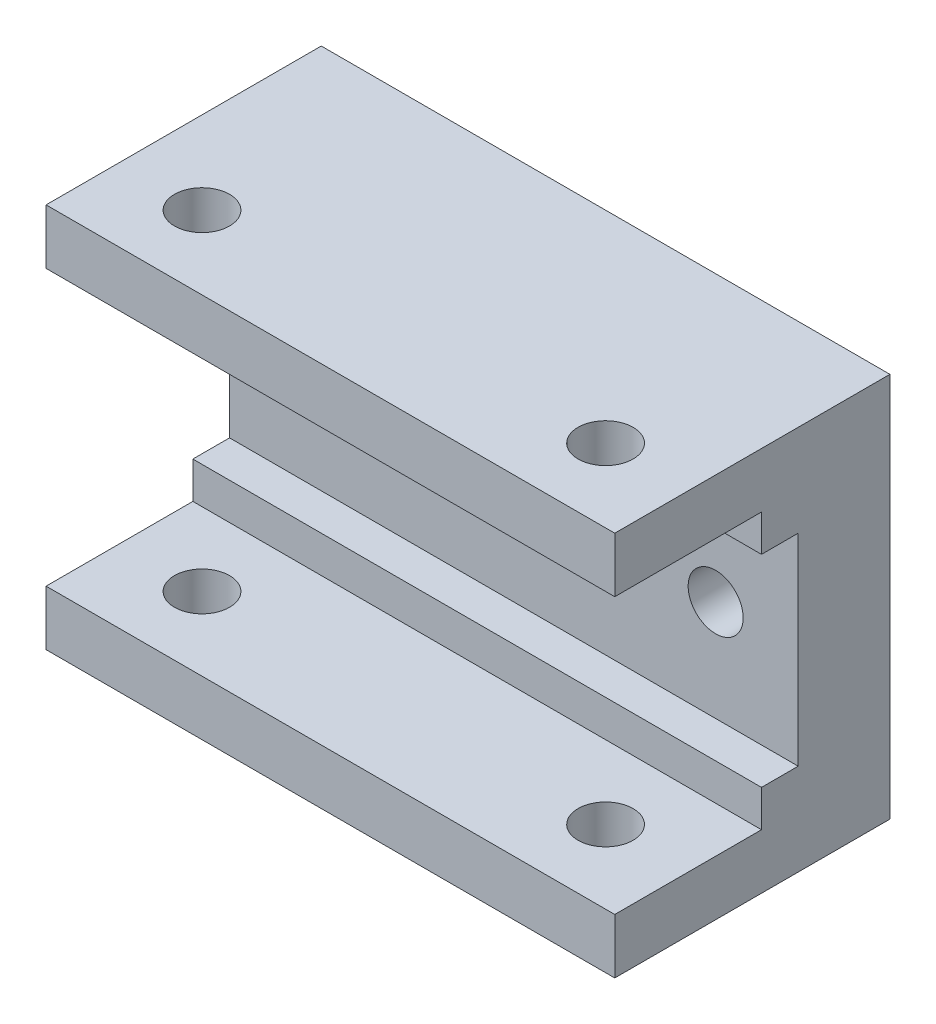
ISO-10303-21;
HEADER;
FILE_DESCRIPTION(('STEP AP214'),'2;1');
FILE_NAME('part.step','',(''),(''),'','','');
FILE_SCHEMA(('AUTOMOTIVE_DESIGN { 1 0 10303 214 1 1 1 1 }'));
ENDSEC;
DATA;
#1=APPLICATION_CONTEXT('core data for automotive mechanical design processes');
#2=APPLICATION_PROTOCOL_DEFINITION('international standard','automotive_design',2000,#1);
#3=PRODUCT_CONTEXT('',#1,'mechanical');
#4=PRODUCT('Part','Part','',(#3));
#5=PRODUCT_RELATED_PRODUCT_CATEGORY('part','',(#4));
#6=PRODUCT_DEFINITION_FORMATION('','',#4);
#7=PRODUCT_DEFINITION_CONTEXT('part definition',#1,'design');
#8=PRODUCT_DEFINITION('design','',#6,#7);
#9=PRODUCT_DEFINITION_SHAPE('','',#8);
#10=(LENGTH_UNIT() NAMED_UNIT(*) SI_UNIT(.MILLI.,.METRE.));
#11=(NAMED_UNIT(*) PLANE_ANGLE_UNIT() SI_UNIT($,.RADIAN.));
#12=(NAMED_UNIT(*) SI_UNIT($,.STERADIAN.) SOLID_ANGLE_UNIT());
#13=UNCERTAINTY_MEASURE_WITH_UNIT(LENGTH_MEASURE(1.E-05),#10,'distance_accuracy_value','');
#14=(GEOMETRIC_REPRESENTATION_CONTEXT(3) GLOBAL_UNCERTAINTY_ASSIGNED_CONTEXT((#13)) GLOBAL_UNIT_ASSIGNED_CONTEXT((#10,
#11,#12)) REPRESENTATION_CONTEXT('',''));
#15=CARTESIAN_POINT('',(0.,0.,0.));
#16=DIRECTION('',(0.,0.,1.));
#17=DIRECTION('',(1.,0.,0.));
#18=AXIS2_PLACEMENT_3D('',#15,#16,#17);
#19=CARTESIAN_POINT('',(0.,0.,5.));
#20=DIRECTION('',(0.,0.,1.));
#21=DIRECTION('',(1.,0.,0.));
#22=AXIS2_PLACEMENT_3D('',#19,#20,#21);
#23=PLANE('',#22);
#24=CARTESIAN_POINT('',(11.,0.,5.));
#25=DIRECTION('',(0.,0.,1.));
#26=DIRECTION('',(1.,0.,0.));
#27=AXIS2_PLACEMENT_3D('',#24,#25,#26);
#28=CIRCLE('',#27,1.5);
#29=CARTESIAN_POINT('',(12.5,0.,5.));
#30=VERTEX_POINT('',#29);
#31=EDGE_CURVE('E207',#30,#30,#28,.T.);
#32=ORIENTED_EDGE('',*,*,#31,.F.);
#33=EDGE_LOOP('',(#32));
#34=FACE_BOUND('',#33,.T.);
#35=CARTESIAN_POINT('',(-11.,0.,5.));
#36=DIRECTION('',(0.,0.,1.));
#37=DIRECTION('',(1.,0.,0.));
#38=AXIS2_PLACEMENT_3D('',#35,#36,#37);
#39=CIRCLE('',#38,1.5);
#40=CARTESIAN_POINT('',(-9.5,0.,5.));
#41=VERTEX_POINT('',#40);
#42=EDGE_CURVE('E200',#41,#41,#39,.T.);
#43=ORIENTED_EDGE('',*,*,#42,.F.);
#44=EDGE_LOOP('',(#43));
#45=FACE_BOUND('',#44,.T.);
#46=DIRECTION('',(0.,-1.,0.));
#47=VECTOR('',#46,1.);
#48=CARTESIAN_POINT('',(-15.5,10.5,5.));
#49=LINE('',#48,#47);
#50=CARTESIAN_POINT('',(-15.5,5.5,5.));
#51=VERTEX_POINT('',#50);
#52=CARTESIAN_POINT('',(-15.5,-5.49999999999999,5.));
#53=VERTEX_POINT('',#52);
#54=EDGE_CURVE('E62',#51,#53,#49,.T.);
#55=ORIENTED_EDGE('',*,*,#54,.T.);
#56=DIRECTION('',(-1.,0.,0.));
#57=VECTOR('',#56,1.);
#58=CARTESIAN_POINT('',(-15.5,-5.5,5.));
#59=LINE('',#58,#57);
#60=CARTESIAN_POINT('',(15.5,-5.49999999999999,5.));
#61=VERTEX_POINT('',#60);
#62=EDGE_CURVE('E57',#61,#53,#59,.T.);
#63=ORIENTED_EDGE('',*,*,#62,.F.);
#64=DIRECTION('',(0.,1.,0.));
#65=VECTOR('',#64,1.);
#66=CARTESIAN_POINT('',(15.5,10.5,5.));
#67=LINE('',#66,#65);
#68=CARTESIAN_POINT('',(15.5,5.5,5.));
#69=VERTEX_POINT('',#68);
#70=EDGE_CURVE('E274',#61,#69,#67,.T.);
#71=ORIENTED_EDGE('',*,*,#70,.T.);
#72=DIRECTION('',(1.,0.,0.));
#73=VECTOR('',#72,1.);
#74=CARTESIAN_POINT('',(-15.5,5.5,5.));
#75=LINE('',#74,#73);
#76=EDGE_CURVE('E171',#51,#69,#75,.T.);
#77=ORIENTED_EDGE('',*,*,#76,.F.);
#78=EDGE_LOOP('',(#55,#63,#71,#77));
#79=FACE_BOUND('',#78,.T.);
#80=ADVANCED_FACE('F39',(#34,#45,#79),#23,.T.);
#81=CARTESIAN_POINT('',(-15.5,-7.5,15.));
#82=DIRECTION('',(0.,-1.,0.));
#83=DIRECTION('',(0.,0.,-1.));
#84=AXIS2_PLACEMENT_3D('',#81,#82,#83);
#85=PLANE('',#84);
#86=CARTESIAN_POINT('',(-11.,-7.5,11.));
#87=DIRECTION('',(0.,-1.,0.));
#88=DIRECTION('',(0.,0.,-1.));
#89=AXIS2_PLACEMENT_3D('',#86,#87,#88);
#90=CIRCLE('',#89,1.5);
#91=CARTESIAN_POINT('',(-11.,-7.5,12.5));
#92=VERTEX_POINT('',#91);
#93=EDGE_CURVE('E216',#92,#92,#90,.T.);
#94=ORIENTED_EDGE('',*,*,#93,.T.);
#95=EDGE_LOOP('',(#94));
#96=FACE_BOUND('',#95,.T.);
#97=CARTESIAN_POINT('',(11.,-7.5,11.));
#98=DIRECTION('',(0.,-1.,0.));
#99=DIRECTION('',(0.,0.,-1.));
#100=AXIS2_PLACEMENT_3D('',#97,#98,#99);
#101=CIRCLE('',#100,1.5);
#102=CARTESIAN_POINT('',(11.,-7.5,12.5));
#103=VERTEX_POINT('',#102);
#104=EDGE_CURVE('E43',#103,#103,#101,.T.);
#105=ORIENTED_EDGE('',*,*,#104,.T.);
#106=EDGE_LOOP('',(#105));
#107=FACE_BOUND('',#106,.T.);
#108=DIRECTION('',(1.,0.,0.));
#109=VECTOR('',#108,1.);
#110=CARTESIAN_POINT('',(-15.5,-7.5,7.));
#111=LINE('',#110,#109);
#112=CARTESIAN_POINT('',(-15.5,-7.5,7.));
#113=VERTEX_POINT('',#112);
#114=CARTESIAN_POINT('',(15.5,-7.5,7.));
#115=VERTEX_POINT('',#114);
#116=EDGE_CURVE('E134',#113,#115,#111,.T.);
#117=ORIENTED_EDGE('',*,*,#116,.F.);
#118=DIRECTION('',(0.,0.,-1.));
#119=VECTOR('',#118,1.);
#120=CARTESIAN_POINT('',(-15.5,-7.5,15.));
#121=LINE('',#120,#119);
#122=CARTESIAN_POINT('',(-15.5,-7.5,15.));
#123=VERTEX_POINT('',#122);
#124=EDGE_CURVE('E142',#123,#113,#121,.T.);
#125=ORIENTED_EDGE('',*,*,#124,.F.);
#126=DIRECTION('',(-1.,0.,0.));
#127=VECTOR('',#126,1.);
#128=CARTESIAN_POINT('',(-15.5,-7.5,15.));
#129=LINE('',#128,#127);
#130=CARTESIAN_POINT('',(15.5,-7.5,15.));
#131=VERTEX_POINT('',#130);
#132=EDGE_CURVE('E136',#131,#123,#129,.T.);
#133=ORIENTED_EDGE('',*,*,#132,.F.);
#134=DIRECTION('',(0.,0.,-1.));
#135=VECTOR('',#134,1.);
#136=CARTESIAN_POINT('',(15.5,-7.5,15.));
#137=LINE('',#136,#135);
#138=EDGE_CURVE('E130',#131,#115,#137,.T.);
#139=ORIENTED_EDGE('',*,*,#138,.T.);
#140=EDGE_LOOP('',(#117,#125,#133,#139));
#141=FACE_BOUND('',#140,.T.);
#142=ADVANCED_FACE('F132',(#96,#107,#141),#85,.F.);
#143=CARTESIAN_POINT('',(15.5,10.5,5.));
#144=DIRECTION('',(-1.,0.,0.));
#145=DIRECTION('',(0.,-1.,0.));
#146=AXIS2_PLACEMENT_3D('',#143,#144,#145);
#147=PLANE('',#146);
#148=ORIENTED_EDGE('',*,*,#70,.F.);
#149=DIRECTION('',(0.,0.,-1.));
#150=VECTOR('',#149,1.);
#151=CARTESIAN_POINT('',(15.5,-5.5,7.));
#152=LINE('',#151,#150);
#153=CARTESIAN_POINT('',(15.5,-5.5,7.));
#154=VERTEX_POINT('',#153);
#155=EDGE_CURVE('E154',#154,#61,#152,.T.);
#156=ORIENTED_EDGE('',*,*,#155,.F.);
#157=DIRECTION('',(0.,1.,0.));
#158=VECTOR('',#157,1.);
#159=CARTESIAN_POINT('',(15.5,-7.5,7.));
#160=LINE('',#159,#158);
#161=EDGE_CURVE('E147',#115,#154,#160,.T.);
#162=ORIENTED_EDGE('',*,*,#161,.F.);
#163=ORIENTED_EDGE('',*,*,#138,.F.);
#164=DIRECTION('',(0.,1.,0.));
#165=VECTOR('',#164,1.);
#166=CARTESIAN_POINT('',(15.5,-10.5,15.));
#167=LINE('',#166,#165);
#168=CARTESIAN_POINT('',(15.5,-10.5,15.));
#169=VERTEX_POINT('',#168);
#170=EDGE_CURVE('E244',#169,#131,#167,.T.);
#171=ORIENTED_EDGE('',*,*,#170,.F.);
#172=DIRECTION('',(0.,0.,-1.));
#173=VECTOR('',#172,1.);
#174=CARTESIAN_POINT('',(15.5,-10.5,5.));
#175=LINE('',#174,#173);
#176=CARTESIAN_POINT('',(15.5,-10.5,0.));
#177=VERTEX_POINT('',#176);
#178=EDGE_CURVE('E280',#169,#177,#175,.T.);
#179=ORIENTED_EDGE('',*,*,#178,.T.);
#180=DIRECTION('',(0.,1.,0.));
#181=VECTOR('',#180,1.);
#182=CARTESIAN_POINT('',(15.5,10.5,0.));
#183=LINE('',#182,#181);
#184=CARTESIAN_POINT('',(15.5,10.5,0.));
#185=VERTEX_POINT('',#184);
#186=EDGE_CURVE('E273',#177,#185,#183,.T.);
#187=ORIENTED_EDGE('',*,*,#186,.T.);
#188=DIRECTION('',(0.,0.,-1.));
#189=VECTOR('',#188,1.);
#190=CARTESIAN_POINT('',(15.5,10.5,5.));
#191=LINE('',#190,#189);
#192=CARTESIAN_POINT('',(15.5,10.5,15.));
#193=VERTEX_POINT('',#192);
#194=EDGE_CURVE('E11',#193,#185,#191,.T.);
#195=ORIENTED_EDGE('',*,*,#194,.F.);
#196=DIRECTION('',(0.,1.,0.));
#197=VECTOR('',#196,1.);
#198=CARTESIAN_POINT('',(15.5,10.5,15.));
#199=LINE('',#198,#197);
#200=CARTESIAN_POINT('',(15.5,7.5,15.));
#201=VERTEX_POINT('',#200);
#202=EDGE_CURVE('E257',#201,#193,#199,.T.);
#203=ORIENTED_EDGE('',*,*,#202,.F.);
#204=DIRECTION('',(0.,0.,-1.));
#205=VECTOR('',#204,1.);
#206=CARTESIAN_POINT('',(15.5,7.5,15.));
#207=LINE('',#206,#205);
#208=CARTESIAN_POINT('',(15.5,7.5,7.));
#209=VERTEX_POINT('',#208);
#210=EDGE_CURVE('E265',#201,#209,#207,.T.);
#211=ORIENTED_EDGE('',*,*,#210,.T.);
#212=DIRECTION('',(0.,1.,0.));
#213=VECTOR('',#212,1.);
#214=CARTESIAN_POINT('',(15.5,7.5,7.));
#215=LINE('',#214,#213);
#216=CARTESIAN_POINT('',(15.5,5.5,7.));
#217=VERTEX_POINT('',#216);
#218=EDGE_CURVE('E179',#217,#209,#215,.T.);
#219=ORIENTED_EDGE('',*,*,#218,.F.);
#220=DIRECTION('',(0.,0.,-1.));
#221=VECTOR('',#220,1.);
#222=CARTESIAN_POINT('',(15.5,5.5,7.));
#223=LINE('',#222,#221);
#224=EDGE_CURVE('E185',#217,#69,#223,.T.);
#225=ORIENTED_EDGE('',*,*,#224,.T.);
#226=EDGE_LOOP('',(#148,#156,#162,#163,#171,#179,#187,#195,#203,#211,#219,#225));
#227=FACE_BOUND('',#226,.T.);
#228=ADVANCED_FACE('F41',(#227),#147,.F.);
#229=CARTESIAN_POINT('',(-15.5,10.5,5.));
#230=DIRECTION('',(0.,-1.,0.));
#231=DIRECTION('',(0.,0.,-1.));
#232=AXIS2_PLACEMENT_3D('',#229,#230,#231);
#233=PLANE('',#232);
#234=CARTESIAN_POINT('',(11.,10.5,11.));
#235=DIRECTION('',(0.,1.,0.));
#236=DIRECTION('',(0.,0.,1.));
#237=AXIS2_PLACEMENT_3D('',#234,#235,#236);
#238=CIRCLE('',#237,1.5);
#239=CARTESIAN_POINT('',(11.,10.5,12.5));
#240=VERTEX_POINT('',#239);
#241=EDGE_CURVE('E217',#240,#240,#238,.T.);
#242=ORIENTED_EDGE('',*,*,#241,.F.);
#243=EDGE_LOOP('',(#242));
#244=FACE_BOUND('',#243,.T.);
#245=CARTESIAN_POINT('',(-11.,10.5,11.));
#246=DIRECTION('',(0.,1.,0.));
#247=DIRECTION('',(0.,0.,-1.));
#248=AXIS2_PLACEMENT_3D('',#245,#246,#247);
#249=CIRCLE('',#248,1.5);
#250=CARTESIAN_POINT('',(-11.,10.5,12.5));
#251=VERTEX_POINT('',#250);
#252=EDGE_CURVE('E211',#251,#251,#249,.T.);
#253=ORIENTED_EDGE('',*,*,#252,.F.);
#254=EDGE_LOOP('',(#253));
#255=FACE_BOUND('',#254,.T.);
#256=DIRECTION('',(-1.,0.,0.));
#257=VECTOR('',#256,1.);
#258=CARTESIAN_POINT('',(-15.5,10.5,0.));
#259=LINE('',#258,#257);
#260=CARTESIAN_POINT('',(-15.5,10.5,0.));
#261=VERTEX_POINT('',#260);
#262=EDGE_CURVE('E284',#185,#261,#259,.T.);
#263=ORIENTED_EDGE('',*,*,#262,.T.);
#264=DIRECTION('',(0.,0.,-1.));
#265=VECTOR('',#264,1.);
#266=CARTESIAN_POINT('',(-15.5,10.5,5.));
#267=LINE('',#266,#265);
#268=CARTESIAN_POINT('',(-15.5,10.5,15.));
#269=VERTEX_POINT('',#268);
#270=EDGE_CURVE('E49',#269,#261,#267,.T.);
#271=ORIENTED_EDGE('',*,*,#270,.F.);
#272=DIRECTION('',(-1.,0.,0.));
#273=VECTOR('',#272,1.);
#274=CARTESIAN_POINT('',(-15.5,10.5,15.));
#275=LINE('',#274,#273);
#276=EDGE_CURVE('E261',#193,#269,#275,.T.);
#277=ORIENTED_EDGE('',*,*,#276,.F.);
#278=ORIENTED_EDGE('',*,*,#194,.T.);
#279=EDGE_LOOP('',(#263,#271,#277,#278));
#280=FACE_BOUND('',#279,.T.);
#281=ADVANCED_FACE('F350',(#244,#255,#280),#233,.F.);
#282=CARTESIAN_POINT('',(-15.5,10.5,5.));
#283=DIRECTION('',(1.,0.,0.));
#284=DIRECTION('',(0.,0.,-1.));
#285=AXIS2_PLACEMENT_3D('',#282,#283,#284);
#286=PLANE('',#285);
#287=ORIENTED_EDGE('',*,*,#54,.F.);
#288=DIRECTION('',(0.,0.,-1.));
#289=VECTOR('',#288,1.);
#290=CARTESIAN_POINT('',(-15.5,5.5,7.));
#291=LINE('',#290,#289);
#292=CARTESIAN_POINT('',(-15.5,5.5,7.));
#293=VERTEX_POINT('',#292);
#294=EDGE_CURVE('E192',#293,#51,#291,.T.);
#295=ORIENTED_EDGE('',*,*,#294,.F.);
#296=DIRECTION('',(0.,-1.,0.));
#297=VECTOR('',#296,1.);
#298=CARTESIAN_POINT('',(-15.5,7.5,7.));
#299=LINE('',#298,#297);
#300=CARTESIAN_POINT('',(-15.5,7.5,7.));
#301=VERTEX_POINT('',#300);
#302=EDGE_CURVE('E172',#301,#293,#299,.T.);
#303=ORIENTED_EDGE('',*,*,#302,.F.);
#304=DIRECTION('',(0.,0.,-1.));
#305=VECTOR('',#304,1.);
#306=CARTESIAN_POINT('',(-15.5,7.5,15.));
#307=LINE('',#306,#305);
#308=CARTESIAN_POINT('',(-15.5,7.5,15.));
#309=VERTEX_POINT('',#308);
#310=EDGE_CURVE('E269',#309,#301,#307,.T.);
#311=ORIENTED_EDGE('',*,*,#310,.F.);
#312=DIRECTION('',(0.,-1.,0.));
#313=VECTOR('',#312,1.);
#314=CARTESIAN_POINT('',(-15.5,10.5,15.));
#315=LINE('',#314,#313);
#316=EDGE_CURVE('E141',#269,#309,#315,.T.);
#317=ORIENTED_EDGE('',*,*,#316,.F.);
#318=ORIENTED_EDGE('',*,*,#270,.T.);
#319=DIRECTION('',(0.,-1.,0.));
#320=VECTOR('',#319,1.);
#321=CARTESIAN_POINT('',(-15.5,10.5,0.));
#322=LINE('',#321,#320);
#323=CARTESIAN_POINT('',(-15.5,-10.5,0.));
#324=VERTEX_POINT('',#323);
#325=EDGE_CURVE('E287',#261,#324,#322,.T.);
#326=ORIENTED_EDGE('',*,*,#325,.T.);
#327=DIRECTION('',(0.,0.,-1.));
#328=VECTOR('',#327,1.);
#329=CARTESIAN_POINT('',(-15.5,-10.5,5.));
#330=LINE('',#329,#328);
#331=CARTESIAN_POINT('',(-15.5,-10.5,15.));
#332=VERTEX_POINT('',#331);
#333=EDGE_CURVE('E295',#332,#324,#330,.T.);
#334=ORIENTED_EDGE('',*,*,#333,.F.);
#335=DIRECTION('',(0.,-1.,0.));
#336=VECTOR('',#335,1.);
#337=CARTESIAN_POINT('',(-15.5,-10.5,15.));
#338=LINE('',#337,#336);
#339=EDGE_CURVE('E236',#123,#332,#338,.T.);
#340=ORIENTED_EDGE('',*,*,#339,.F.);
#341=ORIENTED_EDGE('',*,*,#124,.T.);
#342=DIRECTION('',(0.,-1.,0.));
#343=VECTOR('',#342,1.);
#344=CARTESIAN_POINT('',(-15.5,-7.5,7.));
#345=LINE('',#344,#343);
#346=CARTESIAN_POINT('',(-15.5,-5.5,7.));
#347=VERTEX_POINT('',#346);
#348=EDGE_CURVE('E150',#347,#113,#345,.T.);
#349=ORIENTED_EDGE('',*,*,#348,.F.);
#350=DIRECTION('',(0.,0.,-1.));
#351=VECTOR('',#350,1.);
#352=CARTESIAN_POINT('',(-15.5,-5.5,7.));
#353=LINE('',#352,#351);
#354=EDGE_CURVE('E160',#347,#53,#353,.T.);
#355=ORIENTED_EDGE('',*,*,#354,.T.);
#356=EDGE_LOOP('',(#287,#295,#303,#311,#317,#318,#326,#334,#340,#341,#349,#355));
#357=FACE_BOUND('',#356,.T.);
#358=ADVANCED_FACE('F347',(#357),#286,.F.);
#359=CARTESIAN_POINT('',(-15.5,-10.5,5.));
#360=DIRECTION('',(0.,1.,0.));
#361=DIRECTION('',(0.,0.,1.));
#362=AXIS2_PLACEMENT_3D('',#359,#360,#361);
#363=PLANE('',#362);
#364=CARTESIAN_POINT('',(11.,-10.5,11.));
#365=DIRECTION('',(0.,1.,0.));
#366=DIRECTION('',(0.,0.,1.));
#367=AXIS2_PLACEMENT_3D('',#364,#365,#366);
#368=CIRCLE('',#367,1.5);
#369=CARTESIAN_POINT('',(11.,-10.5,12.5));
#370=VERTEX_POINT('',#369);
#371=EDGE_CURVE('E212',#370,#370,#368,.T.);
#372=ORIENTED_EDGE('',*,*,#371,.T.);
#373=EDGE_LOOP('',(#372));
#374=FACE_BOUND('',#373,.T.);
#375=CARTESIAN_POINT('',(-11.,-10.5,11.));
#376=DIRECTION('',(0.,1.,0.));
#377=DIRECTION('',(0.,0.,-1.));
#378=AXIS2_PLACEMENT_3D('',#375,#376,#377);
#379=CIRCLE('',#378,1.5);
#380=CARTESIAN_POINT('',(-11.,-10.5,12.5));
#381=VERTEX_POINT('',#380);
#382=EDGE_CURVE('E221',#381,#381,#379,.T.);
#383=ORIENTED_EDGE('',*,*,#382,.T.);
#384=EDGE_LOOP('',(#383));
#385=FACE_BOUND('',#384,.T.);
#386=DIRECTION('',(1.,0.,0.));
#387=VECTOR('',#386,1.);
#388=CARTESIAN_POINT('',(-15.5,-10.5,0.));
#389=LINE('',#388,#387);
#390=EDGE_CURVE('E277',#324,#177,#389,.T.);
#391=ORIENTED_EDGE('',*,*,#390,.T.);
#392=ORIENTED_EDGE('',*,*,#178,.F.);
#393=DIRECTION('',(1.,0.,0.));
#394=VECTOR('',#393,1.);
#395=CARTESIAN_POINT('',(-15.5,-10.5,15.));
#396=LINE('',#395,#394);
#397=EDGE_CURVE('E240',#332,#169,#396,.T.);
#398=ORIENTED_EDGE('',*,*,#397,.F.);
#399=ORIENTED_EDGE('',*,*,#333,.T.);
#400=EDGE_LOOP('',(#391,#392,#398,#399));
#401=FACE_BOUND('',#400,.T.);
#402=ADVANCED_FACE('F343',(#374,#385,#401),#363,.F.);
#403=CARTESIAN_POINT('',(0.,0.,0.));
#404=DIRECTION('',(0.,0.,1.));
#405=DIRECTION('',(1.,0.,0.));
#406=AXIS2_PLACEMENT_3D('',#403,#404,#405);
#407=PLANE('',#406);
#408=CARTESIAN_POINT('',(11.,0.,0.));
#409=DIRECTION('',(0.,0.,-1.));
#410=DIRECTION('',(-1.,0.,0.));
#411=AXIS2_PLACEMENT_3D('',#408,#409,#410);
#412=CIRCLE('',#411,1.5);
#413=CARTESIAN_POINT('',(9.5,0.,0.));
#414=VERTEX_POINT('',#413);
#415=EDGE_CURVE('E196',#414,#414,#412,.T.);
#416=ORIENTED_EDGE('',*,*,#415,.F.);
#417=EDGE_LOOP('',(#416));
#418=FACE_BOUND('',#417,.T.);
#419=CARTESIAN_POINT('',(-11.,0.,0.));
#420=DIRECTION('',(0.,0.,-1.));
#421=DIRECTION('',(1.,0.,0.));
#422=AXIS2_PLACEMENT_3D('',#419,#420,#421);
#423=CIRCLE('',#422,1.5);
#424=CARTESIAN_POINT('',(-9.5,0.,0.));
#425=VERTEX_POINT('',#424);
#426=EDGE_CURVE('E195',#425,#425,#423,.T.);
#427=ORIENTED_EDGE('',*,*,#426,.F.);
#428=EDGE_LOOP('',(#427));
#429=FACE_BOUND('',#428,.T.);
#430=ORIENTED_EDGE('',*,*,#186,.F.);
#431=ORIENTED_EDGE('',*,*,#390,.F.);
#432=ORIENTED_EDGE('',*,*,#325,.F.);
#433=ORIENTED_EDGE('',*,*,#262,.F.);
#434=EDGE_LOOP('',(#430,#431,#432,#433));
#435=FACE_BOUND('',#434,.T.);
#436=ADVANCED_FACE('F340',(#418,#429,#435),#407,.F.);
#437=CARTESIAN_POINT('',(-15.5,7.5,15.));
#438=DIRECTION('',(0.,1.,0.));
#439=DIRECTION('',(-1.,0.,0.));
#440=AXIS2_PLACEMENT_3D('',#437,#438,#439);
#441=PLANE('',#440);
#442=CARTESIAN_POINT('',(11.,7.5,11.));
#443=DIRECTION('',(0.,1.,0.));
#444=DIRECTION('',(-1.,0.,0.));
#445=AXIS2_PLACEMENT_3D('',#442,#443,#444);
#446=CIRCLE('',#445,1.5);
#447=CARTESIAN_POINT('',(11.,7.5,12.5));
#448=VERTEX_POINT('',#447);
#449=EDGE_CURVE('E232',#448,#448,#446,.T.);
#450=ORIENTED_EDGE('',*,*,#449,.T.);
#451=EDGE_LOOP('',(#450));
#452=FACE_BOUND('',#451,.T.);
#453=CARTESIAN_POINT('',(-11.,7.5,11.));
#454=DIRECTION('',(0.,1.,0.));
#455=DIRECTION('',(-1.,0.,0.));
#456=AXIS2_PLACEMENT_3D('',#453,#454,#455);
#457=CIRCLE('',#456,1.5);
#458=CARTESIAN_POINT('',(-11.,7.5,12.5));
#459=VERTEX_POINT('',#458);
#460=EDGE_CURVE('E228',#459,#459,#457,.T.);
#461=ORIENTED_EDGE('',*,*,#460,.T.);
#462=EDGE_LOOP('',(#461));
#463=FACE_BOUND('',#462,.T.);
#464=ORIENTED_EDGE('',*,*,#310,.T.);
#465=DIRECTION('',(-1.,0.,0.));
#466=VECTOR('',#465,1.);
#467=CARTESIAN_POINT('',(-15.5,7.5,7.));
#468=LINE('',#467,#466);
#469=EDGE_CURVE('E182',#209,#301,#468,.T.);
#470=ORIENTED_EDGE('',*,*,#469,.F.);
#471=ORIENTED_EDGE('',*,*,#210,.F.);
#472=DIRECTION('',(1.,0.,0.));
#473=VECTOR('',#472,1.);
#474=CARTESIAN_POINT('',(-15.5,7.5,15.));
#475=LINE('',#474,#473);
#476=EDGE_CURVE('E254',#309,#201,#475,.T.);
#477=ORIENTED_EDGE('',*,*,#476,.F.);
#478=EDGE_LOOP('',(#464,#470,#471,#477));
#479=FACE_BOUND('',#478,.T.);
#480=ADVANCED_FACE('F338',(#452,#463,#479),#441,.F.);
#481=CARTESIAN_POINT('',(0.,0.,15.));
#482=DIRECTION('',(0.,0.,1.));
#483=DIRECTION('',(1.,0.,0.));
#484=AXIS2_PLACEMENT_3D('',#481,#482,#483);
#485=PLANE('',#484);
#486=ORIENTED_EDGE('',*,*,#316,.T.);
#487=ORIENTED_EDGE('',*,*,#476,.T.);
#488=ORIENTED_EDGE('',*,*,#202,.T.);
#489=ORIENTED_EDGE('',*,*,#276,.T.);
#490=EDGE_LOOP('',(#486,#487,#488,#489));
#491=FACE_BOUND('',#490,.T.);
#492=ADVANCED_FACE('F321',(#491),#485,.T.);
#493=CARTESIAN_POINT('',(0.,0.,15.));
#494=DIRECTION('',(0.,0.,-1.));
#495=DIRECTION('',(-1.,0.,0.));
#496=AXIS2_PLACEMENT_3D('',#493,#494,#495);
#497=PLANE('',#496);
#498=ORIENTED_EDGE('',*,*,#339,.T.);
#499=ORIENTED_EDGE('',*,*,#397,.T.);
#500=ORIENTED_EDGE('',*,*,#170,.T.);
#501=ORIENTED_EDGE('',*,*,#132,.T.);
#502=EDGE_LOOP('',(#498,#499,#500,#501));
#503=FACE_BOUND('',#502,.T.);
#504=ADVANCED_FACE('F310',(#503),#497,.F.);
#505=CARTESIAN_POINT('',(-11.,-10.5,11.));
#506=DIRECTION('',(0.,1.,0.));
#507=DIRECTION('',(0.,0.,1.));
#508=AXIS2_PLACEMENT_3D('',#505,#506,#507);
#509=CYLINDRICAL_SURFACE('',#508,1.5);
#510=CARTESIAN_POINT('',(-11.,-10.5,12.5));
#511=CARTESIAN_POINT('',(-11.,-10.46875,12.5));
#512=CARTESIAN_POINT('',(-11.,-10.4375,12.5));
#513=CARTESIAN_POINT('',(-11.,-10.375,12.5));
#514=CARTESIAN_POINT('',(-11.,-10.34375,12.5));
#515=CARTESIAN_POINT('',(-11.,-10.28125,12.5));
#516=CARTESIAN_POINT('',(-11.,-10.25,12.5));
#517=CARTESIAN_POINT('',(-11.,-10.1875,12.5));
#518=CARTESIAN_POINT('',(-11.,-10.15625,12.5));
#519=CARTESIAN_POINT('',(-11.,-10.09375,12.5));
#520=CARTESIAN_POINT('',(-11.,-10.0625,12.5));
#521=CARTESIAN_POINT('',(-11.,-10.,12.5));
#522=CARTESIAN_POINT('',(-11.,-9.96875,12.5));
#523=CARTESIAN_POINT('',(-11.,-9.90625,12.5));
#524=CARTESIAN_POINT('',(-11.,-9.875,12.5));
#525=CARTESIAN_POINT('',(-11.,-9.8125,12.5));
#526=CARTESIAN_POINT('',(-11.,-9.78125,12.5));
#527=CARTESIAN_POINT('',(-11.,-9.71875,12.5));
#528=CARTESIAN_POINT('',(-11.,-9.6875,12.5));
#529=CARTESIAN_POINT('',(-11.,-9.625,12.5));
#530=CARTESIAN_POINT('',(-11.,-9.59375,12.5));
#531=CARTESIAN_POINT('',(-11.,-9.53125,12.5));
#532=CARTESIAN_POINT('',(-11.,-9.5,12.5));
#533=CARTESIAN_POINT('',(-11.,-9.4375,12.5));
#534=CARTESIAN_POINT('',(-11.,-9.40625,12.5));
#535=CARTESIAN_POINT('',(-11.,-9.34375,12.5));
#536=CARTESIAN_POINT('',(-11.,-9.3125,12.5));
#537=CARTESIAN_POINT('',(-11.,-9.25,12.5));
#538=CARTESIAN_POINT('',(-11.,-9.21875,12.5));
#539=CARTESIAN_POINT('',(-11.,-9.15625,12.5));
#540=CARTESIAN_POINT('',(-11.,-9.125,12.5));
#541=CARTESIAN_POINT('',(-11.,-9.0625,12.5));
#542=CARTESIAN_POINT('',(-11.,-9.03125,12.5));
#543=CARTESIAN_POINT('',(-11.,-8.96875,12.5));
#544=CARTESIAN_POINT('',(-11.,-8.9375,12.5));
#545=CARTESIAN_POINT('',(-11.,-8.875,12.5));
#546=CARTESIAN_POINT('',(-11.,-8.84375,12.5));
#547=CARTESIAN_POINT('',(-11.,-8.78125,12.5));
#548=CARTESIAN_POINT('',(-11.,-8.75,12.5));
#549=CARTESIAN_POINT('',(-11.,-8.6875,12.5));
#550=CARTESIAN_POINT('',(-11.,-8.65625,12.5));
#551=CARTESIAN_POINT('',(-11.,-8.59375,12.5));
#552=CARTESIAN_POINT('',(-11.,-8.5625,12.5));
#553=CARTESIAN_POINT('',(-11.,-8.5,12.5));
#554=CARTESIAN_POINT('',(-11.,-8.46875,12.5));
#555=CARTESIAN_POINT('',(-11.,-8.40625,12.5));
#556=CARTESIAN_POINT('',(-11.,-8.375,12.5));
#557=CARTESIAN_POINT('',(-11.,-8.3125,12.5));
#558=CARTESIAN_POINT('',(-11.,-8.28125,12.5));
#559=CARTESIAN_POINT('',(-11.,-8.21875,12.5));
#560=CARTESIAN_POINT('',(-11.,-8.1875,12.5));
#561=CARTESIAN_POINT('',(-11.,-8.125,12.5));
#562=CARTESIAN_POINT('',(-11.,-8.09375,12.5));
#563=CARTESIAN_POINT('',(-11.,-8.03125,12.5));
#564=CARTESIAN_POINT('',(-11.,-8.,12.5));
#565=CARTESIAN_POINT('',(-11.,-7.9375,12.5));
#566=CARTESIAN_POINT('',(-11.,-7.90625,12.5));
#567=CARTESIAN_POINT('',(-11.,-7.84375,12.5));
#568=CARTESIAN_POINT('',(-11.,-7.8125,12.5));
#569=CARTESIAN_POINT('',(-11.,-7.75,12.5));
#570=CARTESIAN_POINT('',(-11.,-7.71875,12.5));
#571=CARTESIAN_POINT('',(-11.,-7.65625,12.5));
#572=CARTESIAN_POINT('',(-11.,-7.625,12.5));
#573=CARTESIAN_POINT('',(-11.,-7.5625,12.5));
#574=CARTESIAN_POINT('',(-11.,-7.53125,12.5));
#575=CARTESIAN_POINT('',(-11.,-7.5,12.5));
#576=B_SPLINE_CURVE_WITH_KNOTS('',3,(#510,#511,#512,#513,#514,#515,#516,#517,#518,#519,#520,
#521,#522,#523,#524,#525,#526,#527,#528,#529,#530,#531,#532,#533,#534,#535,#536,#537,#538,#539,
#540,#541,#542,#543,#544,#545,#546,#547,#548,#549,#550,#551,#552,#553,#554,#555,#556,#557,#558,
#559,#560,#561,#562,#563,#564,#565,#566,#567,#568,#569,#570,#571,#572,#573,#574,#575),
.UNSPECIFIED.,.F.,.F.,(4,2,2,2,2,2,2,2,2,2,2,2,2,2,2,2,2,2,2,2,2,2,2,2,2,2,2,2,2,2,2,2,4),(0.,
0.0937499999999983,0.187499999999998,0.281249999999999,0.374999999999999,0.468749999999999,
0.562499999999999,0.656249999999999,0.749999999999999,0.843749999999999,0.937499999999999,
1.03125,1.125,1.21875,1.3125,1.40625,1.5,1.59375,1.6875,1.78125,1.875,1.96875,2.0625,2.15625,
2.25,2.34375,2.4375,2.53125,2.625,2.71875,2.8125,2.90625,3.),.UNSPECIFIED.);
#577=EDGE_CURVE('BSEAM307',#381,#92,#576,.T.);
#578=ORIENTED_EDGE('',*,*,#382,.F.);
#579=ORIENTED_EDGE('',*,*,#93,.F.);
#580=ORIENTED_EDGE('',*,*,#577,.T.);
#581=ORIENTED_EDGE('',*,*,#577,.F.);
#582=EDGE_LOOP('',(#578,#580,#579,#581));
#583=FACE_BOUND('',#582,.T.);
#584=ADVANCED_FACE('F307',(#583),#509,.F.);
#585=CARTESIAN_POINT('',(11.,-10.5,11.));
#586=DIRECTION('',(0.,1.,0.));
#587=DIRECTION('',(0.,0.,1.));
#588=AXIS2_PLACEMENT_3D('',#585,#586,#587);
#589=CYLINDRICAL_SURFACE('',#588,1.5);
#590=CARTESIAN_POINT('',(11.,-10.5,12.5));
#591=CARTESIAN_POINT('',(11.,-10.46875,12.5));
#592=CARTESIAN_POINT('',(11.,-10.4375,12.5));
#593=CARTESIAN_POINT('',(11.,-10.375,12.5));
#594=CARTESIAN_POINT('',(11.,-10.34375,12.5));
#595=CARTESIAN_POINT('',(11.,-10.28125,12.5));
#596=CARTESIAN_POINT('',(11.,-10.25,12.5));
#597=CARTESIAN_POINT('',(11.,-10.1875,12.5));
#598=CARTESIAN_POINT('',(11.,-10.15625,12.5));
#599=CARTESIAN_POINT('',(11.,-10.09375,12.5));
#600=CARTESIAN_POINT('',(11.,-10.0625,12.5));
#601=CARTESIAN_POINT('',(11.,-10.,12.5));
#602=CARTESIAN_POINT('',(11.,-9.96875,12.5));
#603=CARTESIAN_POINT('',(11.,-9.90625,12.5));
#604=CARTESIAN_POINT('',(11.,-9.875,12.5));
#605=CARTESIAN_POINT('',(11.,-9.8125,12.5));
#606=CARTESIAN_POINT('',(11.,-9.78125,12.5));
#607=CARTESIAN_POINT('',(11.,-9.71875,12.5));
#608=CARTESIAN_POINT('',(11.,-9.6875,12.5));
#609=CARTESIAN_POINT('',(11.,-9.625,12.5));
#610=CARTESIAN_POINT('',(11.,-9.59375,12.5));
#611=CARTESIAN_POINT('',(11.,-9.53125,12.5));
#612=CARTESIAN_POINT('',(11.,-9.5,12.5));
#613=CARTESIAN_POINT('',(11.,-9.4375,12.5));
#614=CARTESIAN_POINT('',(11.,-9.40625,12.5));
#615=CARTESIAN_POINT('',(11.,-9.34375,12.5));
#616=CARTESIAN_POINT('',(11.,-9.3125,12.5));
#617=CARTESIAN_POINT('',(11.,-9.25,12.5));
#618=CARTESIAN_POINT('',(11.,-9.21875,12.5));
#619=CARTESIAN_POINT('',(11.,-9.15625,12.5));
#620=CARTESIAN_POINT('',(11.,-9.125,12.5));
#621=CARTESIAN_POINT('',(11.,-9.0625,12.5));
#622=CARTESIAN_POINT('',(11.,-9.03125,12.5));
#623=CARTESIAN_POINT('',(11.,-8.96875,12.5));
#624=CARTESIAN_POINT('',(11.,-8.9375,12.5));
#625=CARTESIAN_POINT('',(11.,-8.875,12.5));
#626=CARTESIAN_POINT('',(11.,-8.84375,12.5));
#627=CARTESIAN_POINT('',(11.,-8.78125,12.5));
#628=CARTESIAN_POINT('',(11.,-8.75,12.5));
#629=CARTESIAN_POINT('',(11.,-8.6875,12.5));
#630=CARTESIAN_POINT('',(11.,-8.65625,12.5));
#631=CARTESIAN_POINT('',(11.,-8.59375,12.5));
#632=CARTESIAN_POINT('',(11.,-8.5625,12.5));
#633=CARTESIAN_POINT('',(11.,-8.5,12.5));
#634=CARTESIAN_POINT('',(11.,-8.46875,12.5));
#635=CARTESIAN_POINT('',(11.,-8.40625,12.5));
#636=CARTESIAN_POINT('',(11.,-8.375,12.5));
#637=CARTESIAN_POINT('',(11.,-8.3125,12.5));
#638=CARTESIAN_POINT('',(11.,-8.28125,12.5));
#639=CARTESIAN_POINT('',(11.,-8.21875,12.5));
#640=CARTESIAN_POINT('',(11.,-8.1875,12.5));
#641=CARTESIAN_POINT('',(11.,-8.125,12.5));
#642=CARTESIAN_POINT('',(11.,-8.09375,12.5));
#643=CARTESIAN_POINT('',(11.,-8.03125,12.5));
#644=CARTESIAN_POINT('',(11.,-8.,12.5));
#645=CARTESIAN_POINT('',(11.,-7.9375,12.5));
#646=CARTESIAN_POINT('',(11.,-7.90625,12.5));
#647=CARTESIAN_POINT('',(11.,-7.84375,12.5));
#648=CARTESIAN_POINT('',(11.,-7.8125,12.5));
#649=CARTESIAN_POINT('',(11.,-7.75,12.5));
#650=CARTESIAN_POINT('',(11.,-7.71875,12.5));
#651=CARTESIAN_POINT('',(11.,-7.65625,12.5));
#652=CARTESIAN_POINT('',(11.,-7.625,12.5));
#653=CARTESIAN_POINT('',(11.,-7.5625,12.5));
#654=CARTESIAN_POINT('',(11.,-7.53125,12.5));
#655=CARTESIAN_POINT('',(11.,-7.5,12.5));
#656=B_SPLINE_CURVE_WITH_KNOTS('',3,(#590,#591,#592,#593,#594,#595,#596,#597,#598,#599,#600,
#601,#602,#603,#604,#605,#606,#607,#608,#609,#610,#611,#612,#613,#614,#615,#616,#617,#618,#619,
#620,#621,#622,#623,#624,#625,#626,#627,#628,#629,#630,#631,#632,#633,#634,#635,#636,#637,#638,
#639,#640,#641,#642,#643,#644,#645,#646,#647,#648,#649,#650,#651,#652,#653,#654,#655),
.UNSPECIFIED.,.F.,.F.,(4,2,2,2,2,2,2,2,2,2,2,2,2,2,2,2,2,2,2,2,2,2,2,2,2,2,2,2,2,2,2,2,4),(0.,
0.0937499999999983,0.187499999999998,0.281249999999999,0.374999999999999,0.468749999999999,
0.562499999999999,0.656249999999999,0.749999999999999,0.843749999999999,0.937499999999999,
1.03125,1.125,1.21875,1.3125,1.40625,1.5,1.59375,1.6875,1.78125,1.875,1.96875,2.0625,2.15625,
2.25,2.34375,2.4375,2.53125,2.625,2.71875,2.8125,2.90625,3.),.UNSPECIFIED.);
#657=EDGE_CURVE('BSEAM309',#370,#103,#656,.T.);
#658=ORIENTED_EDGE('',*,*,#371,.F.);
#659=ORIENTED_EDGE('',*,*,#104,.F.);
#660=ORIENTED_EDGE('',*,*,#657,.T.);
#661=ORIENTED_EDGE('',*,*,#657,.F.);
#662=EDGE_LOOP('',(#658,#660,#659,#661));
#663=FACE_BOUND('',#662,.T.);
#664=ADVANCED_FACE('F309',(#663),#589,.F.);
#665=CARTESIAN_POINT('',(-11.,10.5,12.5));
#666=CARTESIAN_POINT('',(-11.,10.46875,12.5));
#667=CARTESIAN_POINT('',(-11.,10.4375,12.5));
#668=CARTESIAN_POINT('',(-11.,10.375,12.5));
#669=CARTESIAN_POINT('',(-11.,10.34375,12.5));
#670=CARTESIAN_POINT('',(-11.,10.28125,12.5));
#671=CARTESIAN_POINT('',(-11.,10.25,12.5));
#672=CARTESIAN_POINT('',(-11.,10.1875,12.5));
#673=CARTESIAN_POINT('',(-11.,10.15625,12.5));
#674=CARTESIAN_POINT('',(-11.,10.09375,12.5));
#675=CARTESIAN_POINT('',(-11.,10.0625,12.5));
#676=CARTESIAN_POINT('',(-11.,10.,12.5));
#677=CARTESIAN_POINT('',(-11.,9.96875,12.5));
#678=CARTESIAN_POINT('',(-11.,9.90625,12.5));
#679=CARTESIAN_POINT('',(-11.,9.875,12.5));
#680=CARTESIAN_POINT('',(-11.,9.8125,12.5));
#681=CARTESIAN_POINT('',(-11.,9.78125,12.5));
#682=CARTESIAN_POINT('',(-11.,9.71875,12.5));
#683=CARTESIAN_POINT('',(-11.,9.6875,12.5));
#684=CARTESIAN_POINT('',(-11.,9.625,12.5));
#685=CARTESIAN_POINT('',(-11.,9.59375,12.5));
#686=CARTESIAN_POINT('',(-11.,9.53125,12.5));
#687=CARTESIAN_POINT('',(-11.,9.5,12.5));
#688=CARTESIAN_POINT('',(-11.,9.4375,12.5));
#689=CARTESIAN_POINT('',(-11.,9.40625,12.5));
#690=CARTESIAN_POINT('',(-11.,9.34375,12.5));
#691=CARTESIAN_POINT('',(-11.,9.3125,12.5));
#692=CARTESIAN_POINT('',(-11.,9.25,12.5));
#693=CARTESIAN_POINT('',(-11.,9.21875,12.5));
#694=CARTESIAN_POINT('',(-11.,9.15625,12.5));
#695=CARTESIAN_POINT('',(-11.,9.125,12.5));
#696=CARTESIAN_POINT('',(-11.,9.0625,12.5));
#697=CARTESIAN_POINT('',(-11.,9.03125,12.5));
#698=CARTESIAN_POINT('',(-11.,8.96875,12.5));
#699=CARTESIAN_POINT('',(-11.,8.9375,12.5));
#700=CARTESIAN_POINT('',(-11.,8.875,12.5));
#701=CARTESIAN_POINT('',(-11.,8.84375,12.5));
#702=CARTESIAN_POINT('',(-11.,8.78125,12.5));
#703=CARTESIAN_POINT('',(-11.,8.75,12.5));
#704=CARTESIAN_POINT('',(-11.,8.6875,12.5));
#705=CARTESIAN_POINT('',(-11.,8.65625,12.5));
#706=CARTESIAN_POINT('',(-11.,8.59375,12.5));
#707=CARTESIAN_POINT('',(-11.,8.5625,12.5));
#708=CARTESIAN_POINT('',(-11.,8.5,12.5));
#709=CARTESIAN_POINT('',(-11.,8.46875,12.5));
#710=CARTESIAN_POINT('',(-11.,8.40625,12.5));
#711=CARTESIAN_POINT('',(-11.,8.375,12.5));
#712=CARTESIAN_POINT('',(-11.,8.3125,12.5));
#713=CARTESIAN_POINT('',(-11.,8.28125,12.5));
#714=CARTESIAN_POINT('',(-11.,8.21875,12.5));
#715=CARTESIAN_POINT('',(-11.,8.1875,12.5));
#716=CARTESIAN_POINT('',(-11.,8.125,12.5));
#717=CARTESIAN_POINT('',(-11.,8.09375,12.5));
#718=CARTESIAN_POINT('',(-11.,8.03125,12.5));
#719=CARTESIAN_POINT('',(-11.,8.,12.5));
#720=CARTESIAN_POINT('',(-11.,7.9375,12.5));
#721=CARTESIAN_POINT('',(-11.,7.90625,12.5));
#722=CARTESIAN_POINT('',(-11.,7.84375,12.5));
#723=CARTESIAN_POINT('',(-11.,7.8125,12.5));
#724=CARTESIAN_POINT('',(-11.,7.75,12.5));
#725=CARTESIAN_POINT('',(-11.,7.71875,12.5));
#726=CARTESIAN_POINT('',(-11.,7.65625,12.5));
#727=CARTESIAN_POINT('',(-11.,7.625,12.5));
#728=CARTESIAN_POINT('',(-11.,7.5625,12.5));
#729=CARTESIAN_POINT('',(-11.,7.53125,12.5));
#730=CARTESIAN_POINT('',(-11.,7.5,12.5));
#731=B_SPLINE_CURVE_WITH_KNOTS('',3,(#665,#666,#667,#668,#669,#670,#671,#672,#673,#674,#675,
#676,#677,#678,#679,#680,#681,#682,#683,#684,#685,#686,#687,#688,#689,#690,#691,#692,#693,#694,
#695,#696,#697,#698,#699,#700,#701,#702,#703,#704,#705,#706,#707,#708,#709,#710,#711,#712,#713,
#714,#715,#716,#717,#718,#719,#720,#721,#722,#723,#724,#725,#726,#727,#728,#729,#730),
.UNSPECIFIED.,.F.,.F.,(4,2,2,2,2,2,2,2,2,2,2,2,2,2,2,2,2,2,2,2,2,2,2,2,2,2,2,2,2,2,2,2,4),(0.,
0.0937500000000001,0.1875,0.28125,0.375,0.46875,0.5625,0.656250000000001,0.750000000000001,
0.843750000000001,0.937500000000001,1.03125,1.125,1.21875,1.3125,1.40625,1.5,1.59375,1.6875,
1.78125,1.875,1.96875,2.0625,2.15625,2.25,2.34375,2.4375,2.53125,2.625,2.71875,2.8125,2.90625,
3.),.UNSPECIFIED.);
#732=EDGE_CURVE('BSEAM313',#251,#459,#731,.T.);
#733=ORIENTED_EDGE('',*,*,#252,.T.);
#734=ORIENTED_EDGE('',*,*,#460,.F.);
#735=ORIENTED_EDGE('',*,*,#732,.T.);
#736=ORIENTED_EDGE('',*,*,#732,.F.);
#737=EDGE_LOOP('',(#733,#735,#734,#736));
#738=FACE_BOUND('',#737,.T.);
#739=ADVANCED_FACE('F313',(#738),#509,.F.);
#740=CARTESIAN_POINT('',(11.,10.5,12.5));
#741=CARTESIAN_POINT('',(11.,10.46875,12.5));
#742=CARTESIAN_POINT('',(11.,10.4375,12.5));
#743=CARTESIAN_POINT('',(11.,10.375,12.5));
#744=CARTESIAN_POINT('',(11.,10.34375,12.5));
#745=CARTESIAN_POINT('',(11.,10.28125,12.5));
#746=CARTESIAN_POINT('',(11.,10.25,12.5));
#747=CARTESIAN_POINT('',(11.,10.1875,12.5));
#748=CARTESIAN_POINT('',(11.,10.15625,12.5));
#749=CARTESIAN_POINT('',(11.,10.09375,12.5));
#750=CARTESIAN_POINT('',(11.,10.0625,12.5));
#751=CARTESIAN_POINT('',(11.,10.,12.5));
#752=CARTESIAN_POINT('',(11.,9.96875,12.5));
#753=CARTESIAN_POINT('',(11.,9.90625,12.5));
#754=CARTESIAN_POINT('',(11.,9.875,12.5));
#755=CARTESIAN_POINT('',(11.,9.8125,12.5));
#756=CARTESIAN_POINT('',(11.,9.78125,12.5));
#757=CARTESIAN_POINT('',(11.,9.71875,12.5));
#758=CARTESIAN_POINT('',(11.,9.6875,12.5));
#759=CARTESIAN_POINT('',(11.,9.625,12.5));
#760=CARTESIAN_POINT('',(11.,9.59375,12.5));
#761=CARTESIAN_POINT('',(11.,9.53125,12.5));
#762=CARTESIAN_POINT('',(11.,9.5,12.5));
#763=CARTESIAN_POINT('',(11.,9.4375,12.5));
#764=CARTESIAN_POINT('',(11.,9.40625,12.5));
#765=CARTESIAN_POINT('',(11.,9.34375,12.5));
#766=CARTESIAN_POINT('',(11.,9.3125,12.5));
#767=CARTESIAN_POINT('',(11.,9.25,12.5));
#768=CARTESIAN_POINT('',(11.,9.21875,12.5));
#769=CARTESIAN_POINT('',(11.,9.15625,12.5));
#770=CARTESIAN_POINT('',(11.,9.125,12.5));
#771=CARTESIAN_POINT('',(11.,9.0625,12.5));
#772=CARTESIAN_POINT('',(11.,9.03125,12.5));
#773=CARTESIAN_POINT('',(11.,8.96875,12.5));
#774=CARTESIAN_POINT('',(11.,8.9375,12.5));
#775=CARTESIAN_POINT('',(11.,8.875,12.5));
#776=CARTESIAN_POINT('',(11.,8.84375,12.5));
#777=CARTESIAN_POINT('',(11.,8.78125,12.5));
#778=CARTESIAN_POINT('',(11.,8.75,12.5));
#779=CARTESIAN_POINT('',(11.,8.6875,12.5));
#780=CARTESIAN_POINT('',(11.,8.65625,12.5));
#781=CARTESIAN_POINT('',(11.,8.59375,12.5));
#782=CARTESIAN_POINT('',(11.,8.5625,12.5));
#783=CARTESIAN_POINT('',(11.,8.5,12.5));
#784=CARTESIAN_POINT('',(11.,8.46875,12.5));
#785=CARTESIAN_POINT('',(11.,8.40625,12.5));
#786=CARTESIAN_POINT('',(11.,8.375,12.5));
#787=CARTESIAN_POINT('',(11.,8.3125,12.5));
#788=CARTESIAN_POINT('',(11.,8.28125,12.5));
#789=CARTESIAN_POINT('',(11.,8.21875,12.5));
#790=CARTESIAN_POINT('',(11.,8.1875,12.5));
#791=CARTESIAN_POINT('',(11.,8.125,12.5));
#792=CARTESIAN_POINT('',(11.,8.09375,12.5));
#793=CARTESIAN_POINT('',(11.,8.03125,12.5));
#794=CARTESIAN_POINT('',(11.,8.,12.5));
#795=CARTESIAN_POINT('',(11.,7.9375,12.5));
#796=CARTESIAN_POINT('',(11.,7.90625,12.5));
#797=CARTESIAN_POINT('',(11.,7.84375,12.5));
#798=CARTESIAN_POINT('',(11.,7.8125,12.5));
#799=CARTESIAN_POINT('',(11.,7.75,12.5));
#800=CARTESIAN_POINT('',(11.,7.71875,12.5));
#801=CARTESIAN_POINT('',(11.,7.65625,12.5));
#802=CARTESIAN_POINT('',(11.,7.625,12.5));
#803=CARTESIAN_POINT('',(11.,7.5625,12.5));
#804=CARTESIAN_POINT('',(11.,7.53125,12.5));
#805=CARTESIAN_POINT('',(11.,7.5,12.5));
#806=B_SPLINE_CURVE_WITH_KNOTS('',3,(#740,#741,#742,#743,#744,#745,#746,#747,#748,#749,#750,
#751,#752,#753,#754,#755,#756,#757,#758,#759,#760,#761,#762,#763,#764,#765,#766,#767,#768,#769,
#770,#771,#772,#773,#774,#775,#776,#777,#778,#779,#780,#781,#782,#783,#784,#785,#786,#787,#788,
#789,#790,#791,#792,#793,#794,#795,#796,#797,#798,#799,#800,#801,#802,#803,#804,#805),
.UNSPECIFIED.,.F.,.F.,(4,2,2,2,2,2,2,2,2,2,2,2,2,2,2,2,2,2,2,2,2,2,2,2,2,2,2,2,2,2,2,2,4),(0.,
0.0937500000000001,0.1875,0.28125,0.375,0.46875,0.5625,0.656250000000001,0.750000000000001,
0.843750000000001,0.937500000000001,1.03125,1.125,1.21875,1.3125,1.40625,1.5,1.59375,1.6875,
1.78125,1.875,1.96875,2.0625,2.15625,2.25,2.34375,2.4375,2.53125,2.625,2.71875,2.8125,2.90625,
3.),.UNSPECIFIED.);
#807=EDGE_CURVE('BSEAM320',#240,#448,#806,.T.);
#808=ORIENTED_EDGE('',*,*,#241,.T.);
#809=ORIENTED_EDGE('',*,*,#449,.F.);
#810=ORIENTED_EDGE('',*,*,#807,.T.);
#811=ORIENTED_EDGE('',*,*,#807,.F.);
#812=EDGE_LOOP('',(#808,#810,#809,#811));
#813=FACE_BOUND('',#812,.T.);
#814=ADVANCED_FACE('F320',(#813),#589,.F.);
#815=CARTESIAN_POINT('',(-11.,0.,15.));
#816=DIRECTION('',(0.,0.,-1.));
#817=DIRECTION('',(-1.,0.,0.));
#818=AXIS2_PLACEMENT_3D('',#815,#816,#817);
#819=CYLINDRICAL_SURFACE('',#818,1.5);
#820=ORIENTED_EDGE('',*,*,#42,.T.);
#821=EDGE_LOOP('',(#820));
#822=FACE_BOUND('',#821,.T.);
#823=ORIENTED_EDGE('',*,*,#426,.T.);
#824=EDGE_LOOP('',(#823));
#825=FACE_BOUND('',#824,.T.);
#826=ADVANCED_FACE('F394',(#822,#825),#819,.F.);
#827=CARTESIAN_POINT('',(11.,0.,15.));
#828=DIRECTION('',(0.,0.,-1.));
#829=DIRECTION('',(-1.,0.,0.));
#830=AXIS2_PLACEMENT_3D('',#827,#828,#829);
#831=CYLINDRICAL_SURFACE('',#830,1.5);
#832=ORIENTED_EDGE('',*,*,#31,.T.);
#833=EDGE_LOOP('',(#832));
#834=FACE_BOUND('',#833,.T.);
#835=ORIENTED_EDGE('',*,*,#415,.T.);
#836=EDGE_LOOP('',(#835));
#837=FACE_BOUND('',#836,.T.);
#838=ADVANCED_FACE('F390',(#834,#837),#831,.F.);
#839=CARTESIAN_POINT('',(-15.5,5.5,7.));
#840=DIRECTION('',(0.,1.,0.));
#841=DIRECTION('',(0.,0.,1.));
#842=AXIS2_PLACEMENT_3D('',#839,#840,#841);
#843=PLANE('',#842);
#844=ORIENTED_EDGE('',*,*,#76,.T.);
#845=ORIENTED_EDGE('',*,*,#224,.F.);
#846=DIRECTION('',(1.,0.,0.));
#847=VECTOR('',#846,1.);
#848=CARTESIAN_POINT('',(-15.5,5.5,7.));
#849=LINE('',#848,#847);
#850=EDGE_CURVE('E176',#293,#217,#849,.T.);
#851=ORIENTED_EDGE('',*,*,#850,.F.);
#852=ORIENTED_EDGE('',*,*,#294,.T.);
#853=EDGE_LOOP('',(#844,#845,#851,#852));
#854=FACE_BOUND('',#853,.T.);
#855=ADVANCED_FACE('F384',(#854),#843,.F.);
#856=CARTESIAN_POINT('',(0.,0.,7.));
#857=DIRECTION('',(0.,0.,1.));
#858=DIRECTION('',(1.,0.,0.));
#859=AXIS2_PLACEMENT_3D('',#856,#857,#858);
#860=PLANE('',#859);
#861=ORIENTED_EDGE('',*,*,#302,.T.);
#862=ORIENTED_EDGE('',*,*,#850,.T.);
#863=ORIENTED_EDGE('',*,*,#218,.T.);
#864=ORIENTED_EDGE('',*,*,#469,.T.);
#865=EDGE_LOOP('',(#861,#862,#863,#864));
#866=FACE_BOUND('',#865,.T.);
#867=ADVANCED_FACE('F377',(#866),#860,.T.);
#868=CARTESIAN_POINT('',(-15.5,-5.5,7.));
#869=DIRECTION('',(0.,-1.,0.));
#870=DIRECTION('',(1.,0.,0.));
#871=AXIS2_PLACEMENT_3D('',#868,#869,#870);
#872=PLANE('',#871);
#873=ORIENTED_EDGE('',*,*,#62,.T.);
#874=ORIENTED_EDGE('',*,*,#354,.F.);
#875=DIRECTION('',(-1.,0.,0.));
#876=VECTOR('',#875,1.);
#877=CARTESIAN_POINT('',(-15.5,-5.5,7.));
#878=LINE('',#877,#876);
#879=EDGE_CURVE('E157',#154,#347,#878,.T.);
#880=ORIENTED_EDGE('',*,*,#879,.F.);
#881=ORIENTED_EDGE('',*,*,#155,.T.);
#882=EDGE_LOOP('',(#873,#874,#880,#881));
#883=FACE_BOUND('',#882,.T.);
#884=ADVANCED_FACE('F375',(#883),#872,.F.);
#885=CARTESIAN_POINT('',(0.,0.,7.));
#886=DIRECTION('',(0.,0.,-1.));
#887=DIRECTION('',(-1.,0.,0.));
#888=AXIS2_PLACEMENT_3D('',#885,#886,#887);
#889=PLANE('',#888);
#890=ORIENTED_EDGE('',*,*,#348,.T.);
#891=ORIENTED_EDGE('',*,*,#116,.T.);
#892=ORIENTED_EDGE('',*,*,#161,.T.);
#893=ORIENTED_EDGE('',*,*,#879,.T.);
#894=EDGE_LOOP('',(#890,#891,#892,#893));
#895=FACE_BOUND('',#894,.T.);
#896=ADVANCED_FACE('F146',(#895),#889,.F.);
#897=CLOSED_SHELL('',(#80,#142,#228,#281,#358,#402,#436,#480,#492,#504,#584,#664,#739,#814,#826,
#838,#855,#867,#884,#896));
#898=MANIFOLD_SOLID_BREP('B2',#897);
#899=ADVANCED_BREP_SHAPE_REPRESENTATION('',(#18,#898),#14);
#900=SHAPE_DEFINITION_REPRESENTATION(#9,#899);
ENDSEC;
END-ISO-10303-21;
